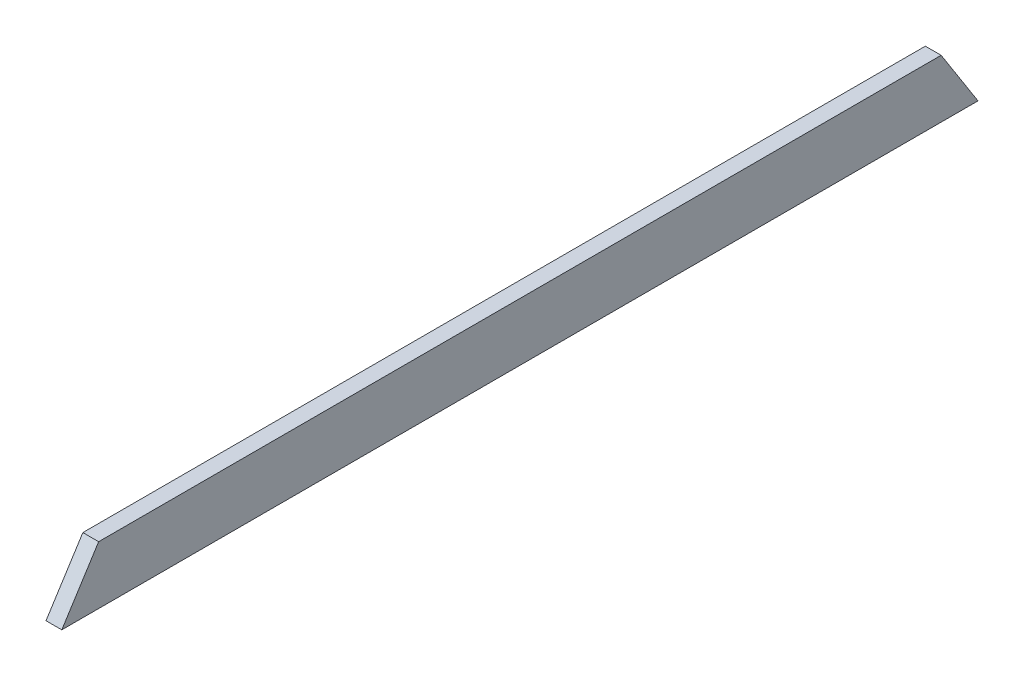
ISO-10303-21;
HEADER;
FILE_DESCRIPTION(('STEP AP214'),'2;1');
FILE_NAME('part.step','',(''),(''),'','','');
FILE_SCHEMA(('AUTOMOTIVE_DESIGN { 1 0 10303 214 1 1 1 1 }'));
ENDSEC;
DATA;
#1=APPLICATION_CONTEXT('core data for automotive mechanical design processes');
#2=APPLICATION_PROTOCOL_DEFINITION('international standard','automotive_design',2000,#1);
#3=PRODUCT_CONTEXT('',#1,'mechanical');
#4=PRODUCT('Part','Part','',(#3));
#5=PRODUCT_RELATED_PRODUCT_CATEGORY('part','',(#4));
#6=PRODUCT_DEFINITION_FORMATION('','',#4);
#7=PRODUCT_DEFINITION_CONTEXT('part definition',#1,'design');
#8=PRODUCT_DEFINITION('design','',#6,#7);
#9=PRODUCT_DEFINITION_SHAPE('','',#8);
#10=(LENGTH_UNIT() NAMED_UNIT(*) SI_UNIT(.MILLI.,.METRE.));
#11=(NAMED_UNIT(*) PLANE_ANGLE_UNIT() SI_UNIT($,.RADIAN.));
#12=(NAMED_UNIT(*) SI_UNIT($,.STERADIAN.) SOLID_ANGLE_UNIT());
#13=UNCERTAINTY_MEASURE_WITH_UNIT(LENGTH_MEASURE(1.E-05),#10,'distance_accuracy_value','');
#14=(GEOMETRIC_REPRESENTATION_CONTEXT(3) GLOBAL_UNCERTAINTY_ASSIGNED_CONTEXT((#13)) GLOBAL_UNIT_ASSIGNED_CONTEXT((#10,
#11,#12)) REPRESENTATION_CONTEXT('',''));
#15=CARTESIAN_POINT('',(0.,0.,0.));
#16=DIRECTION('',(0.,0.,1.));
#17=DIRECTION('',(1.,0.,0.));
#18=AXIS2_PLACEMENT_3D('',#15,#16,#17);
#19=CARTESIAN_POINT('',(3.,11.,80.));
#20=DIRECTION('',(0.,-0.53687549219316,-0.843661487732107));
#21=DIRECTION('',(0.,0.843661487732107,-0.53687549219316));
#22=AXIS2_PLACEMENT_3D('',#19,#20,#21);
#23=PLANE('',#22);
#24=DIRECTION('',(0.,-0.843661487732107,0.53687549219316));
#25=VECTOR('',#24,1.);
#26=CARTESIAN_POINT('',(0.,11.,80.));
#27=LINE('',#26,#25);
#28=CARTESIAN_POINT('',(0.,11.,80.));
#29=VERTEX_POINT('',#28);
#30=CARTESIAN_POINT('',(0.,0.,87.));
#31=VERTEX_POINT('',#30);
#32=EDGE_CURVE('E99',#29,#31,#27,.T.);
#33=ORIENTED_EDGE('',*,*,#32,.T.);
#34=DIRECTION('',(-1.,0.,0.));
#35=VECTOR('',#34,1.);
#36=CARTESIAN_POINT('',(3.,0.,87.));
#37=LINE('',#36,#35);
#38=CARTESIAN_POINT('',(3.,0.,87.));
#39=VERTEX_POINT('',#38);
#40=EDGE_CURVE('E11',#39,#31,#37,.T.);
#41=ORIENTED_EDGE('',*,*,#40,.F.);
#42=DIRECTION('',(0.,-0.843661487732107,0.53687549219316));
#43=VECTOR('',#42,1.);
#44=CARTESIAN_POINT('',(3.,11.,80.));
#45=LINE('',#44,#43);
#46=CARTESIAN_POINT('',(3.,11.,80.));
#47=VERTEX_POINT('',#46);
#48=EDGE_CURVE('E87',#47,#39,#45,.T.);
#49=ORIENTED_EDGE('',*,*,#48,.F.);
#50=DIRECTION('',(-1.,0.,0.));
#51=VECTOR('',#50,1.);
#52=CARTESIAN_POINT('',(3.,11.,80.));
#53=LINE('',#52,#51);
#54=EDGE_CURVE('E95',#47,#29,#53,.T.);
#55=ORIENTED_EDGE('',*,*,#54,.T.);
#56=EDGE_LOOP('',(#33,#41,#49,#55));
#57=FACE_BOUND('',#56,.T.);
#58=ADVANCED_FACE('F36',(#57),#23,.F.);
#59=CARTESIAN_POINT('',(3.,0.,87.));
#60=DIRECTION('',(0.,1.,0.));
#61=DIRECTION('',(0.,0.,1.));
#62=AXIS2_PLACEMENT_3D('',#59,#60,#61);
#63=PLANE('',#62);
#64=DIRECTION('',(0.,0.,-1.));
#65=VECTOR('',#64,1.);
#66=CARTESIAN_POINT('',(0.,0.,87.));
#67=LINE('',#66,#65);
#68=CARTESIAN_POINT('',(0.,0.,-87.));
#69=VERTEX_POINT('',#68);
#70=EDGE_CURVE('E91',#31,#69,#67,.T.);
#71=ORIENTED_EDGE('',*,*,#70,.T.);
#72=DIRECTION('',(-1.,0.,0.));
#73=VECTOR('',#72,1.);
#74=CARTESIAN_POINT('',(3.,0.,-87.));
#75=LINE('',#74,#73);
#76=CARTESIAN_POINT('',(3.,0.,-87.));
#77=VERTEX_POINT('',#76);
#78=EDGE_CURVE('E44',#77,#69,#75,.T.);
#79=ORIENTED_EDGE('',*,*,#78,.F.);
#80=DIRECTION('',(0.,0.,-1.));
#81=VECTOR('',#80,1.);
#82=CARTESIAN_POINT('',(3.,0.,87.));
#83=LINE('',#82,#81);
#84=EDGE_CURVE('E82',#39,#77,#83,.T.);
#85=ORIENTED_EDGE('',*,*,#84,.F.);
#86=ORIENTED_EDGE('',*,*,#40,.T.);
#87=EDGE_LOOP('',(#71,#79,#85,#86));
#88=FACE_BOUND('',#87,.T.);
#89=ADVANCED_FACE('F90',(#88),#63,.F.);
#90=CARTESIAN_POINT('',(3.,0.,-87.));
#91=DIRECTION('',(0.,-0.536875492193158,0.843661487732108));
#92=DIRECTION('',(0.,-0.843661487732108,-0.536875492193158));
#93=AXIS2_PLACEMENT_3D('',#90,#91,#92);
#94=PLANE('',#93);
#95=DIRECTION('',(0.,0.843661487732108,0.536875492193158));
#96=VECTOR('',#95,1.);
#97=CARTESIAN_POINT('',(0.,0.,-87.));
#98=LINE('',#97,#96);
#99=CARTESIAN_POINT('',(0.,11.,-80.));
#100=VERTEX_POINT('',#99);
#101=EDGE_CURVE('E69',#69,#100,#98,.T.);
#102=ORIENTED_EDGE('',*,*,#101,.T.);
#103=DIRECTION('',(-1.,0.,0.));
#104=VECTOR('',#103,1.);
#105=CARTESIAN_POINT('',(3.,11.,-80.));
#106=LINE('',#105,#104);
#107=CARTESIAN_POINT('',(3.,11.,-80.));
#108=VERTEX_POINT('',#107);
#109=EDGE_CURVE('E92',#108,#100,#106,.T.);
#110=ORIENTED_EDGE('',*,*,#109,.F.);
#111=DIRECTION('',(0.,0.843661487732108,0.536875492193158));
#112=VECTOR('',#111,1.);
#113=CARTESIAN_POINT('',(3.,0.,-87.));
#114=LINE('',#113,#112);
#115=EDGE_CURVE('E85',#77,#108,#114,.T.);
#116=ORIENTED_EDGE('',*,*,#115,.F.);
#117=ORIENTED_EDGE('',*,*,#78,.T.);
#118=EDGE_LOOP('',(#102,#110,#116,#117));
#119=FACE_BOUND('',#118,.T.);
#120=ADVANCED_FACE('F93',(#119),#94,.F.);
#121=CARTESIAN_POINT('',(3.,11.,-80.));
#122=DIRECTION('',(0.,-1.,0.));
#123=DIRECTION('',(0.,0.,-1.));
#124=AXIS2_PLACEMENT_3D('',#121,#122,#123);
#125=PLANE('',#124);
#126=DIRECTION('',(0.,0.,1.));
#127=VECTOR('',#126,1.);
#128=CARTESIAN_POINT('',(0.,11.,-80.));
#129=LINE('',#128,#127);
#130=EDGE_CURVE('E75',#100,#29,#129,.T.);
#131=ORIENTED_EDGE('',*,*,#130,.T.);
#132=ORIENTED_EDGE('',*,*,#54,.F.);
#133=DIRECTION('',(0.,0.,1.));
#134=VECTOR('',#133,1.);
#135=CARTESIAN_POINT('',(3.,11.,-80.));
#136=LINE('',#135,#134);
#137=EDGE_CURVE('E52',#108,#47,#136,.T.);
#138=ORIENTED_EDGE('',*,*,#137,.F.);
#139=ORIENTED_EDGE('',*,*,#109,.T.);
#140=EDGE_LOOP('',(#131,#132,#138,#139));
#141=FACE_BOUND('',#140,.T.);
#142=ADVANCED_FACE('F106',(#141),#125,.F.);
#143=CARTESIAN_POINT('',(3.,0.,0.));
#144=DIRECTION('',(-1.,0.,0.));
#145=DIRECTION('',(0.,0.,1.));
#146=AXIS2_PLACEMENT_3D('',#143,#144,#145);
#147=PLANE('',#146);
#148=ORIENTED_EDGE('',*,*,#48,.T.);
#149=ORIENTED_EDGE('',*,*,#84,.T.);
#150=ORIENTED_EDGE('',*,*,#115,.T.);
#151=ORIENTED_EDGE('',*,*,#137,.T.);
#152=EDGE_LOOP('',(#148,#149,#150,#151));
#153=FACE_BOUND('',#152,.T.);
#154=ADVANCED_FACE('F83',(#153),#147,.F.);
#155=CARTESIAN_POINT('',(0.,0.,0.));
#156=DIRECTION('',(-1.,0.,0.));
#157=DIRECTION('',(0.,0.,1.));
#158=AXIS2_PLACEMENT_3D('',#155,#156,#157);
#159=PLANE('',#158);
#160=ORIENTED_EDGE('',*,*,#32,.F.);
#161=ORIENTED_EDGE('',*,*,#130,.F.);
#162=ORIENTED_EDGE('',*,*,#101,.F.);
#163=ORIENTED_EDGE('',*,*,#70,.F.);
#164=EDGE_LOOP('',(#160,#161,#162,#163));
#165=FACE_BOUND('',#164,.T.);
#166=ADVANCED_FACE('F109',(#165),#159,.T.);
#167=CLOSED_SHELL('',(#58,#89,#120,#142,#154,#166));
#168=MANIFOLD_SOLID_BREP('B2',#167);
#169=ADVANCED_BREP_SHAPE_REPRESENTATION('',(#18,#168),#14);
#170=SHAPE_DEFINITION_REPRESENTATION(#9,#169);
ENDSEC;
END-ISO-10303-21;
